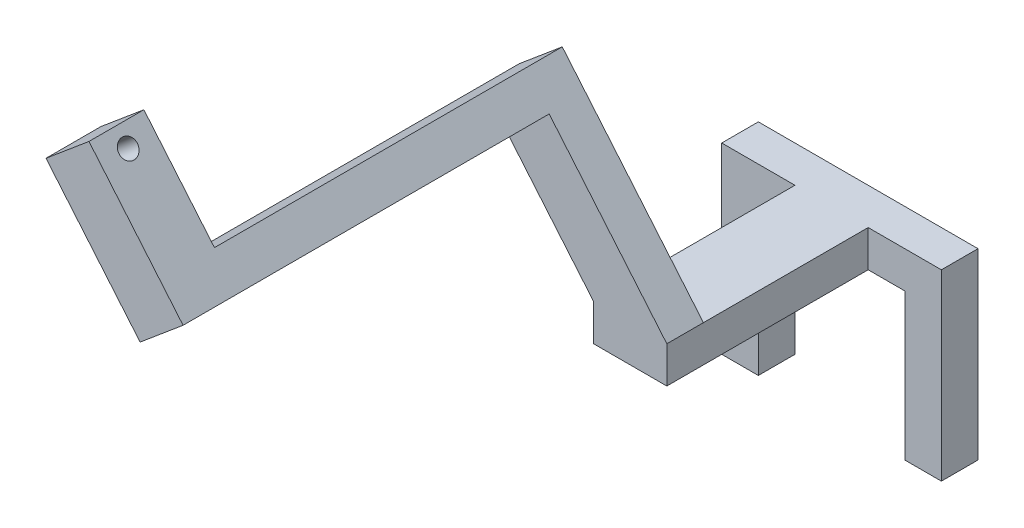
ISO-10303-21;
HEADER;
FILE_DESCRIPTION(('STEP AP214'),'2;1');
FILE_NAME('part.step','',(''),(''),'','','');
FILE_SCHEMA(('AUTOMOTIVE_DESIGN { 1 0 10303 214 1 1 1 1 }'));
ENDSEC;
DATA;
#1=APPLICATION_CONTEXT('core data for automotive mechanical design processes');
#2=APPLICATION_PROTOCOL_DEFINITION('international standard','automotive_design',2000,#1);
#3=PRODUCT_CONTEXT('',#1,'mechanical');
#4=PRODUCT('Part','Part','',(#3));
#5=PRODUCT_RELATED_PRODUCT_CATEGORY('part','',(#4));
#6=PRODUCT_DEFINITION_FORMATION('','',#4);
#7=PRODUCT_DEFINITION_CONTEXT('part definition',#1,'design');
#8=PRODUCT_DEFINITION('design','',#6,#7);
#9=PRODUCT_DEFINITION_SHAPE('','',#8);
#10=(LENGTH_UNIT() NAMED_UNIT(*) SI_UNIT(.MILLI.,.METRE.));
#11=(NAMED_UNIT(*) PLANE_ANGLE_UNIT() SI_UNIT($,.RADIAN.));
#12=(NAMED_UNIT(*) SI_UNIT($,.STERADIAN.) SOLID_ANGLE_UNIT());
#13=UNCERTAINTY_MEASURE_WITH_UNIT(LENGTH_MEASURE(1.E-05),#10,'distance_accuracy_value','');
#14=(GEOMETRIC_REPRESENTATION_CONTEXT(3) GLOBAL_UNCERTAINTY_ASSIGNED_CONTEXT((#13)) GLOBAL_UNIT_ASSIGNED_CONTEXT((#10,
#11,#12)) REPRESENTATION_CONTEXT('',''));
#15=CARTESIAN_POINT('',(0.,0.,0.));
#16=DIRECTION('',(0.,0.,1.));
#17=DIRECTION('',(1.,0.,0.));
#18=AXIS2_PLACEMENT_3D('',#15,#16,#17);
#19=CARTESIAN_POINT('',(0.,0.,10.));
#20=DIRECTION('',(0.,0.,-1.));
#21=DIRECTION('',(-1.,0.,0.));
#22=AXIS2_PLACEMENT_3D('',#19,#20,#21);
#23=PLANE('',#22);
#24=DIRECTION('',(0.,-1.,0.));
#25=VECTOR('',#24,1.);
#26=CARTESIAN_POINT('',(20.,0.,10.));
#27=LINE('',#26,#25);
#28=CARTESIAN_POINT('',(20.,0.,10.));
#29=VERTEX_POINT('',#28);
#30=CARTESIAN_POINT('',(20.,-10.,10.));
#31=VERTEX_POINT('',#30);
#32=EDGE_CURVE('E225',#29,#31,#27,.T.);
#33=ORIENTED_EDGE('',*,*,#32,.F.);
#34=DIRECTION('',(-1.,0.,0.));
#35=VECTOR('',#34,1.);
#36=CARTESIAN_POINT('',(0.,0.,10.));
#37=LINE('',#36,#35);
#38=CARTESIAN_POINT('',(0.,0.,10.));
#39=VERTEX_POINT('',#38);
#40=EDGE_CURVE('E277',#29,#39,#37,.T.);
#41=ORIENTED_EDGE('',*,*,#40,.T.);
#42=DIRECTION('',(0.,-1.,0.));
#43=VECTOR('',#42,1.);
#44=CARTESIAN_POINT('',(0.,-50.,10.));
#45=LINE('',#44,#43);
#46=CARTESIAN_POINT('',(0.,-50.,10.));
#47=VERTEX_POINT('',#46);
#48=EDGE_CURVE('E260',#39,#47,#45,.T.);
#49=ORIENTED_EDGE('',*,*,#48,.T.);
#50=DIRECTION('',(1.,0.,0.));
#51=VECTOR('',#50,1.);
#52=CARTESIAN_POINT('',(10.,-50.,10.));
#53=LINE('',#52,#51);
#54=CARTESIAN_POINT('',(10.,-50.,10.));
#55=VERTEX_POINT('',#54);
#56=EDGE_CURVE('E263',#47,#55,#53,.T.);
#57=ORIENTED_EDGE('',*,*,#56,.T.);
#58=DIRECTION('',(0.,1.,0.));
#59=VECTOR('',#58,1.);
#60=CARTESIAN_POINT('',(10.,-10.,10.));
#61=LINE('',#60,#59);
#62=CARTESIAN_POINT('',(10.,-10.,10.));
#63=VERTEX_POINT('',#62);
#64=EDGE_CURVE('E266',#55,#63,#61,.T.);
#65=ORIENTED_EDGE('',*,*,#64,.T.);
#66=DIRECTION('',(1.,0.,0.));
#67=VECTOR('',#66,1.);
#68=CARTESIAN_POINT('',(50.,-10.,10.));
#69=LINE('',#68,#67);
#70=EDGE_CURVE('E269',#63,#31,#69,.T.);
#71=ORIENTED_EDGE('',*,*,#70,.T.);
#72=EDGE_LOOP('',(#33,#41,#49,#57,#65,#71));
#73=FACE_BOUND('',#72,.T.);
#74=ADVANCED_FACE('F39',(#73),#23,.F.);
#75=DIRECTION('',(0.,1.,0.));
#76=VECTOR('',#75,1.);
#77=CARTESIAN_POINT('',(40.,0.,10.));
#78=LINE('',#77,#76);
#79=CARTESIAN_POINT('',(40.,-10.,10.));
#80=VERTEX_POINT('',#79);
#81=CARTESIAN_POINT('',(40.,0.,10.));
#82=VERTEX_POINT('',#81);
#83=EDGE_CURVE('E237',#80,#82,#78,.T.);
#84=ORIENTED_EDGE('',*,*,#83,.F.);
#85=CARTESIAN_POINT('',(50.,-10.,10.));
#86=VERTEX_POINT('',#85);
#87=EDGE_CURVE('E268',#80,#86,#69,.T.);
#88=ORIENTED_EDGE('',*,*,#87,.T.);
#89=DIRECTION('',(0.,-1.,0.));
#90=VECTOR('',#89,1.);
#91=CARTESIAN_POINT('',(50.,-50.,10.));
#92=LINE('',#91,#90);
#93=CARTESIAN_POINT('',(50.,-50.,10.));
#94=VERTEX_POINT('',#93);
#95=EDGE_CURVE('E271',#86,#94,#92,.T.);
#96=ORIENTED_EDGE('',*,*,#95,.T.);
#97=DIRECTION('',(1.,0.,0.));
#98=VECTOR('',#97,1.);
#99=CARTESIAN_POINT('',(60.,-50.,10.));
#100=LINE('',#99,#98);
#101=CARTESIAN_POINT('',(60.,-50.,10.));
#102=VERTEX_POINT('',#101);
#103=EDGE_CURVE('E273',#94,#102,#100,.T.);
#104=ORIENTED_EDGE('',*,*,#103,.T.);
#105=DIRECTION('',(0.,1.,0.));
#106=VECTOR('',#105,1.);
#107=CARTESIAN_POINT('',(60.,0.,10.));
#108=LINE('',#107,#106);
#109=CARTESIAN_POINT('',(60.,0.,10.));
#110=VERTEX_POINT('',#109);
#111=EDGE_CURVE('E275',#102,#110,#108,.T.);
#112=ORIENTED_EDGE('',*,*,#111,.T.);
#113=EDGE_CURVE('E278',#110,#82,#37,.T.);
#114=ORIENTED_EDGE('',*,*,#113,.T.);
#115=EDGE_LOOP('',(#84,#88,#96,#104,#112,#114));
#116=FACE_BOUND('',#115,.T.);
#117=ADVANCED_FACE('F338',(#116),#23,.F.);
#118=CARTESIAN_POINT('',(0.,-50.,10.));
#119=DIRECTION('',(1.,0.,0.));
#120=DIRECTION('',(0.,0.,-1.));
#121=AXIS2_PLACEMENT_3D('',#118,#119,#120);
#122=PLANE('',#121);
#123=DIRECTION('',(0.,-1.,0.));
#124=VECTOR('',#123,1.);
#125=CARTESIAN_POINT('',(0.,-50.,0.));
#126=LINE('',#125,#124);
#127=CARTESIAN_POINT('',(0.,0.,0.));
#128=VERTEX_POINT('',#127);
#129=CARTESIAN_POINT('',(0.,-50.,0.));
#130=VERTEX_POINT('',#129);
#131=EDGE_CURVE('E259',#128,#130,#126,.T.);
#132=ORIENTED_EDGE('',*,*,#131,.T.);
#133=DIRECTION('',(0.,0.,-1.));
#134=VECTOR('',#133,1.);
#135=CARTESIAN_POINT('',(0.,-50.,10.));
#136=LINE('',#135,#134);
#137=EDGE_CURVE('E11',#47,#130,#136,.T.);
#138=ORIENTED_EDGE('',*,*,#137,.F.);
#139=ORIENTED_EDGE('',*,*,#48,.F.);
#140=DIRECTION('',(0.,0.,-1.));
#141=VECTOR('',#140,1.);
#142=CARTESIAN_POINT('',(0.,0.,10.));
#143=LINE('',#142,#141);
#144=EDGE_CURVE('E281',#39,#128,#143,.T.);
#145=ORIENTED_EDGE('',*,*,#144,.T.);
#146=EDGE_LOOP('',(#132,#138,#139,#145));
#147=FACE_BOUND('',#146,.T.);
#148=ADVANCED_FACE('F41',(#147),#122,.F.);
#149=CARTESIAN_POINT('',(10.,-50.,10.));
#150=DIRECTION('',(0.,1.,0.));
#151=DIRECTION('',(0.,0.,1.));
#152=AXIS2_PLACEMENT_3D('',#149,#150,#151);
#153=PLANE('',#152);
#154=DIRECTION('',(1.,0.,0.));
#155=VECTOR('',#154,1.);
#156=CARTESIAN_POINT('',(10.,-50.,0.));
#157=LINE('',#156,#155);
#158=CARTESIAN_POINT('',(10.,-50.,0.));
#159=VERTEX_POINT('',#158);
#160=EDGE_CURVE('E284',#130,#159,#157,.T.);
#161=ORIENTED_EDGE('',*,*,#160,.T.);
#162=DIRECTION('',(0.,0.,-1.));
#163=VECTOR('',#162,1.);
#164=CARTESIAN_POINT('',(10.,-50.,10.));
#165=LINE('',#164,#163);
#166=EDGE_CURVE('E47',#55,#159,#165,.T.);
#167=ORIENTED_EDGE('',*,*,#166,.F.);
#168=ORIENTED_EDGE('',*,*,#56,.F.);
#169=ORIENTED_EDGE('',*,*,#137,.T.);
#170=EDGE_LOOP('',(#161,#167,#168,#169));
#171=FACE_BOUND('',#170,.T.);
#172=ADVANCED_FACE('F363',(#171),#153,.F.);
#173=CARTESIAN_POINT('',(10.,-10.,10.));
#174=DIRECTION('',(-1.,0.,0.));
#175=DIRECTION('',(0.,-1.,0.));
#176=AXIS2_PLACEMENT_3D('',#173,#174,#175);
#177=PLANE('',#176);
#178=DIRECTION('',(0.,1.,0.));
#179=VECTOR('',#178,1.);
#180=CARTESIAN_POINT('',(10.,-10.,0.));
#181=LINE('',#180,#179);
#182=CARTESIAN_POINT('',(10.,-10.,0.));
#183=VERTEX_POINT('',#182);
#184=EDGE_CURVE('E286',#159,#183,#181,.T.);
#185=ORIENTED_EDGE('',*,*,#184,.T.);
#186=DIRECTION('',(0.,0.,-1.));
#187=VECTOR('',#186,1.);
#188=CARTESIAN_POINT('',(10.,-10.,10.));
#189=LINE('',#188,#187);
#190=EDGE_CURVE('E311',#63,#183,#189,.T.);
#191=ORIENTED_EDGE('',*,*,#190,.F.);
#192=ORIENTED_EDGE('',*,*,#64,.F.);
#193=ORIENTED_EDGE('',*,*,#166,.T.);
#194=EDGE_LOOP('',(#185,#191,#192,#193));
#195=FACE_BOUND('',#194,.T.);
#196=ADVANCED_FACE('F318',(#195),#177,.F.);
#197=CARTESIAN_POINT('',(50.,-10.,10.));
#198=DIRECTION('',(0.,1.,0.));
#199=DIRECTION('',(-1.,0.,0.));
#200=AXIS2_PLACEMENT_3D('',#197,#198,#199);
#201=PLANE('',#200);
#202=DIRECTION('',(1.,0.,0.));
#203=VECTOR('',#202,1.);
#204=CARTESIAN_POINT('',(50.,-10.,0.));
#205=LINE('',#204,#203);
#206=CARTESIAN_POINT('',(50.,-10.,0.));
#207=VERTEX_POINT('',#206);
#208=EDGE_CURVE('E288',#183,#207,#205,.T.);
#209=ORIENTED_EDGE('',*,*,#208,.T.);
#210=DIRECTION('',(0.,0.,-1.));
#211=VECTOR('',#210,1.);
#212=CARTESIAN_POINT('',(50.,-10.,10.));
#213=LINE('',#212,#211);
#214=EDGE_CURVE('E308',#86,#207,#213,.T.);
#215=ORIENTED_EDGE('',*,*,#214,.F.);
#216=ORIENTED_EDGE('',*,*,#87,.F.);
#217=DIRECTION('',(0.,0.,-1.));
#218=VECTOR('',#217,1.);
#219=CARTESIAN_POINT('',(40.,-10.,65.));
#220=LINE('',#219,#218);
#221=CARTESIAN_POINT('',(40.,-10.,65.));
#222=VERTEX_POINT('',#221);
#223=EDGE_CURVE('E253',#222,#80,#220,.T.);
#224=ORIENTED_EDGE('',*,*,#223,.F.);
#225=DIRECTION('',(1.,0.,0.));
#226=VECTOR('',#225,1.);
#227=CARTESIAN_POINT('',(20.,-10.,65.));
#228=LINE('',#227,#226);
#229=CARTESIAN_POINT('',(20.,-10.,65.));
#230=VERTEX_POINT('',#229);
#231=EDGE_CURVE('E236',#230,#222,#228,.T.);
#232=ORIENTED_EDGE('',*,*,#231,.F.);
#233=DIRECTION('',(0.,0.,-1.));
#234=VECTOR('',#233,1.);
#235=CARTESIAN_POINT('',(20.,-10.,65.));
#236=LINE('',#235,#234);
#237=EDGE_CURVE('E256',#230,#31,#236,.T.);
#238=ORIENTED_EDGE('',*,*,#237,.T.);
#239=ORIENTED_EDGE('',*,*,#70,.F.);
#240=ORIENTED_EDGE('',*,*,#190,.T.);
#241=EDGE_LOOP('',(#209,#215,#216,#224,#232,#238,#239,#240));
#242=FACE_BOUND('',#241,.T.);
#243=ADVANCED_FACE('F329',(#242),#201,.F.);
#244=CARTESIAN_POINT('',(50.,-50.,10.));
#245=DIRECTION('',(1.,0.,0.));
#246=DIRECTION('',(0.,0.,-1.));
#247=AXIS2_PLACEMENT_3D('',#244,#245,#246);
#248=PLANE('',#247);
#249=DIRECTION('',(0.,-1.,0.));
#250=VECTOR('',#249,1.);
#251=CARTESIAN_POINT('',(50.,-50.,0.));
#252=LINE('',#251,#250);
#253=CARTESIAN_POINT('',(50.,-50.,0.));
#254=VERTEX_POINT('',#253);
#255=EDGE_CURVE('E290',#207,#254,#252,.T.);
#256=ORIENTED_EDGE('',*,*,#255,.T.);
#257=DIRECTION('',(0.,0.,-1.));
#258=VECTOR('',#257,1.);
#259=CARTESIAN_POINT('',(50.,-50.,10.));
#260=LINE('',#259,#258);
#261=EDGE_CURVE('E305',#94,#254,#260,.T.);
#262=ORIENTED_EDGE('',*,*,#261,.F.);
#263=ORIENTED_EDGE('',*,*,#95,.F.);
#264=ORIENTED_EDGE('',*,*,#214,.T.);
#265=EDGE_LOOP('',(#256,#262,#263,#264));
#266=FACE_BOUND('',#265,.T.);
#267=ADVANCED_FACE('F334',(#266),#248,.F.);
#268=CARTESIAN_POINT('',(60.,-50.,10.));
#269=DIRECTION('',(0.,1.,0.));
#270=DIRECTION('',(0.,0.,1.));
#271=AXIS2_PLACEMENT_3D('',#268,#269,#270);
#272=PLANE('',#271);
#273=DIRECTION('',(1.,0.,0.));
#274=VECTOR('',#273,1.);
#275=CARTESIAN_POINT('',(60.,-50.,0.));
#276=LINE('',#275,#274);
#277=CARTESIAN_POINT('',(60.,-50.,0.));
#278=VERTEX_POINT('',#277);
#279=EDGE_CURVE('E292',#254,#278,#276,.T.);
#280=ORIENTED_EDGE('',*,*,#279,.T.);
#281=DIRECTION('',(0.,0.,-1.));
#282=VECTOR('',#281,1.);
#283=CARTESIAN_POINT('',(60.,-50.,10.));
#284=LINE('',#283,#282);
#285=EDGE_CURVE('E302',#102,#278,#284,.T.);
#286=ORIENTED_EDGE('',*,*,#285,.F.);
#287=ORIENTED_EDGE('',*,*,#103,.F.);
#288=ORIENTED_EDGE('',*,*,#261,.T.);
#289=EDGE_LOOP('',(#280,#286,#287,#288));
#290=FACE_BOUND('',#289,.T.);
#291=ADVANCED_FACE('F414',(#290),#272,.F.);
#292=CARTESIAN_POINT('',(60.,0.,10.));
#293=DIRECTION('',(-1.,0.,0.));
#294=DIRECTION('',(0.,-1.,0.));
#295=AXIS2_PLACEMENT_3D('',#292,#293,#294);
#296=PLANE('',#295);
#297=DIRECTION('',(0.,1.,0.));
#298=VECTOR('',#297,1.);
#299=CARTESIAN_POINT('',(60.,0.,0.));
#300=LINE('',#299,#298);
#301=CARTESIAN_POINT('',(60.,0.,0.));
#302=VERTEX_POINT('',#301);
#303=EDGE_CURVE('E294',#278,#302,#300,.T.);
#304=ORIENTED_EDGE('',*,*,#303,.T.);
#305=DIRECTION('',(0.,0.,-1.));
#306=VECTOR('',#305,1.);
#307=CARTESIAN_POINT('',(60.,0.,10.));
#308=LINE('',#307,#306);
#309=EDGE_CURVE('E299',#110,#302,#308,.T.);
#310=ORIENTED_EDGE('',*,*,#309,.F.);
#311=ORIENTED_EDGE('',*,*,#111,.F.);
#312=ORIENTED_EDGE('',*,*,#285,.T.);
#313=EDGE_LOOP('',(#304,#310,#311,#312));
#314=FACE_BOUND('',#313,.T.);
#315=ADVANCED_FACE('F367',(#314),#296,.F.);
#316=CARTESIAN_POINT('',(0.,0.,10.));
#317=DIRECTION('',(0.,-1.,0.));
#318=DIRECTION('',(0.,0.,-1.));
#319=AXIS2_PLACEMENT_3D('',#316,#317,#318);
#320=PLANE('',#319);
#321=DIRECTION('',(0.,0.,-1.));
#322=VECTOR('',#321,1.);
#323=CARTESIAN_POINT('',(20.,0.,65.));
#324=LINE('',#323,#322);
#325=CARTESIAN_POINT('',(20.,0.,55.));
#326=VERTEX_POINT('',#325);
#327=EDGE_CURVE('E242',#326,#29,#324,.T.);
#328=ORIENTED_EDGE('',*,*,#327,.F.);
#329=DIRECTION('',(1.,0.,0.));
#330=VECTOR('',#329,1.);
#331=CARTESIAN_POINT('',(20.,0.,55.));
#332=LINE('',#331,#330);
#333=CARTESIAN_POINT('',(40.,0.,55.));
#334=VERTEX_POINT('',#333);
#335=EDGE_CURVE('E217',#326,#334,#332,.T.);
#336=ORIENTED_EDGE('',*,*,#335,.T.);
#337=DIRECTION('',(0.,0.,-1.));
#338=VECTOR('',#337,1.);
#339=CARTESIAN_POINT('',(40.,0.,65.));
#340=LINE('',#339,#338);
#341=EDGE_CURVE('E250',#334,#82,#340,.T.);
#342=ORIENTED_EDGE('',*,*,#341,.T.);
#343=ORIENTED_EDGE('',*,*,#113,.F.);
#344=ORIENTED_EDGE('',*,*,#309,.T.);
#345=DIRECTION('',(-1.,0.,0.));
#346=VECTOR('',#345,1.);
#347=CARTESIAN_POINT('',(0.,0.,0.));
#348=LINE('',#347,#346);
#349=EDGE_CURVE('E264',#302,#128,#348,.T.);
#350=ORIENTED_EDGE('',*,*,#349,.T.);
#351=ORIENTED_EDGE('',*,*,#144,.F.);
#352=ORIENTED_EDGE('',*,*,#40,.F.);
#353=EDGE_LOOP('',(#328,#336,#342,#343,#344,#350,#351,#352));
#354=FACE_BOUND('',#353,.T.);
#355=ADVANCED_FACE('F358',(#354),#320,.F.);
#356=CARTESIAN_POINT('',(0.,0.,0.));
#357=DIRECTION('',(0.,0.,-1.));
#358=DIRECTION('',(-1.,0.,0.));
#359=AXIS2_PLACEMENT_3D('',#356,#357,#358);
#360=PLANE('',#359);
#361=ORIENTED_EDGE('',*,*,#131,.F.);
#362=ORIENTED_EDGE('',*,*,#349,.F.);
#363=ORIENTED_EDGE('',*,*,#303,.F.);
#364=ORIENTED_EDGE('',*,*,#279,.F.);
#365=ORIENTED_EDGE('',*,*,#255,.F.);
#366=ORIENTED_EDGE('',*,*,#208,.F.);
#367=ORIENTED_EDGE('',*,*,#184,.F.);
#368=ORIENTED_EDGE('',*,*,#160,.F.);
#369=EDGE_LOOP('',(#361,#362,#363,#364,#365,#366,#367,#368));
#370=FACE_BOUND('',#369,.T.);
#371=ADVANCED_FACE('F324',(#370),#360,.T.);
#372=CARTESIAN_POINT('',(20.,0.,65.));
#373=DIRECTION('',(1.,0.,0.));
#374=DIRECTION('',(0.,1.,0.));
#375=AXIS2_PLACEMENT_3D('',#372,#373,#374);
#376=PLANE('',#375);
#377=ORIENTED_EDGE('',*,*,#32,.T.);
#378=ORIENTED_EDGE('',*,*,#237,.F.);
#379=DIRECTION('',(0.,-1.,0.));
#380=VECTOR('',#379,1.);
#381=CARTESIAN_POINT('',(20.,0.,65.));
#382=LINE('',#381,#380);
#383=CARTESIAN_POINT('',(20.,0.,65.));
#384=VERTEX_POINT('',#383);
#385=EDGE_CURVE('E233',#384,#230,#382,.T.);
#386=ORIENTED_EDGE('',*,*,#385,.F.);
#387=EDGE_CURVE('E247',#384,#326,#324,.T.);
#388=ORIENTED_EDGE('',*,*,#387,.T.);
#389=ORIENTED_EDGE('',*,*,#327,.T.);
#390=EDGE_LOOP('',(#377,#378,#386,#388,#389));
#391=FACE_BOUND('',#390,.T.);
#392=ADVANCED_FACE('F352',(#391),#376,.F.);
#393=CARTESIAN_POINT('',(40.,0.,65.));
#394=DIRECTION('',(-1.,0.,0.));
#395=DIRECTION('',(0.,0.,1.));
#396=AXIS2_PLACEMENT_3D('',#393,#394,#395);
#397=PLANE('',#396);
#398=ORIENTED_EDGE('',*,*,#83,.T.);
#399=ORIENTED_EDGE('',*,*,#341,.F.);
#400=CARTESIAN_POINT('',(40.,0.,65.));
#401=VERTEX_POINT('',#400);
#402=EDGE_CURVE('E251',#401,#334,#340,.T.);
#403=ORIENTED_EDGE('',*,*,#402,.F.);
#404=DIRECTION('',(0.,1.,0.));
#405=VECTOR('',#404,1.);
#406=CARTESIAN_POINT('',(40.,0.,65.));
#407=LINE('',#406,#405);
#408=EDGE_CURVE('E239',#222,#401,#407,.T.);
#409=ORIENTED_EDGE('',*,*,#408,.F.);
#410=ORIENTED_EDGE('',*,*,#223,.T.);
#411=EDGE_LOOP('',(#398,#399,#403,#409,#410));
#412=FACE_BOUND('',#411,.T.);
#413=ADVANCED_FACE('F343',(#412),#397,.F.);
#414=CARTESIAN_POINT('',(0.,0.,65.));
#415=DIRECTION('',(0.,0.,1.));
#416=DIRECTION('',(1.,0.,0.));
#417=AXIS2_PLACEMENT_3D('',#414,#415,#416);
#418=PLANE('',#417);
#419=ORIENTED_EDGE('',*,*,#385,.T.);
#420=ORIENTED_EDGE('',*,*,#231,.T.);
#421=ORIENTED_EDGE('',*,*,#408,.T.);
#422=DIRECTION('',(-0.642787609686544,0.766044443118974,0.));
#423=VECTOR('',#422,1.);
#424=CARTESIAN_POINT('',(40.,0.,65.));
#425=LINE('',#424,#423);
#426=CARTESIAN_POINT('',(7.86061951567281,38.3022221559487,65.));
#427=VERTEX_POINT('',#426);
#428=EDGE_CURVE('E216',#401,#427,#425,.T.);
#429=ORIENTED_EDGE('',*,*,#428,.T.);
#430=DIRECTION('',(-0.766044443118974,-0.642787609686544,0.));
#431=VECTOR('',#430,1.);
#432=CARTESIAN_POINT('',(7.86061951567281,38.3022221559487,65.));
#433=LINE('',#432,#431);
#434=CARTESIAN_POINT('',(-3.87586226099637,28.4541446258266,65.));
#435=VERTEX_POINT('',#434);
#436=EDGE_CURVE('E228',#427,#435,#433,.T.);
#437=ORIENTED_EDGE('',*,*,#436,.T.);
#438=DIRECTION('',(0.642787609686544,-0.766044443118975,0.));
#439=VECTOR('',#438,1.);
#440=CARTESIAN_POINT('',(-3.87586226099637,28.4541446258266,65.));
#441=LINE('',#440,#439);
#442=EDGE_CURVE('E220',#435,#384,#441,.T.);
#443=ORIENTED_EDGE('',*,*,#442,.T.);
#444=EDGE_LOOP('',(#419,#420,#421,#429,#437,#443));
#445=FACE_BOUND('',#444,.T.);
#446=ADVANCED_FACE('F347',(#445),#418,.T.);
#447=CARTESIAN_POINT('',(-3.87586226099637,28.4541446258266,55.));
#448=DIRECTION('',(-0.766044443118975,-0.642787609686544,0.));
#449=DIRECTION('',(0.642787609686544,-0.766044443118975,0.));
#450=AXIS2_PLACEMENT_3D('',#447,#448,#449);
#451=PLANE('',#450);
#452=CARTESIAN_POINT('',(-26.3734286000254,55.2657001349907,157.5));
#453=DIRECTION('',(-0.766044443118975,-0.642787609686544,0.));
#454=DIRECTION('',(0.642787609686544,-0.766044443118975,0.));
#455=AXIS2_PLACEMENT_3D('',#452,#453,#454);
#456=CIRCLE('',#455,2.5);
#457=CARTESIAN_POINT('',(-24.7664595758091,53.3505890271933,157.5));
#458=VERTEX_POINT('',#457);
#459=EDGE_CURVE('E376',#458,#458,#456,.T.);
#460=ORIENTED_EDGE('',*,*,#459,.F.);
#461=EDGE_LOOP('',(#460));
#462=FACE_BOUND('',#461,.T.);
#463=ORIENTED_EDGE('',*,*,#442,.F.);
#464=DIRECTION('',(0.,0.,1.));
#465=VECTOR('',#464,1.);
#466=CARTESIAN_POINT('',(-3.87586226099638,28.4541446258266,55.));
#467=LINE('',#466,#465);
#468=CARTESIAN_POINT('',(-3.87586226099637,28.4541446258266,165.));
#469=VERTEX_POINT('',#468);
#470=EDGE_CURVE('E194',#435,#469,#467,.T.);
#471=ORIENTED_EDGE('',*,*,#470,.T.);
#472=DIRECTION('',(0.642787609686544,-0.766044443118974,0.));
#473=VECTOR('',#472,1.);
#474=CARTESIAN_POINT('',(-10.3037383578618,36.1145890570164,165.));
#475=LINE('',#474,#473);
#476=CARTESIAN_POINT('',(-29.5873666484581,59.0959223505856,165.));
#477=VERTEX_POINT('',#476);
#478=EDGE_CURVE('E213',#477,#469,#475,.T.);
#479=ORIENTED_EDGE('',*,*,#478,.F.);
#480=DIRECTION('',(0.,0.,1.));
#481=VECTOR('',#480,1.);
#482=CARTESIAN_POINT('',(-29.5873666484581,59.0959223505856,165.));
#483=LINE('',#482,#481);
#484=CARTESIAN_POINT('',(-29.5873666484581,59.0959223505856,150.));
#485=VERTEX_POINT('',#484);
#486=EDGE_CURVE('E181',#485,#477,#483,.T.);
#487=ORIENTED_EDGE('',*,*,#486,.F.);
#488=DIRECTION('',(0.642787609686544,-0.766044443118974,0.));
#489=VECTOR('',#488,1.);
#490=CARTESIAN_POINT('',(-29.5873666484581,59.0959223505856,150.));
#491=LINE('',#490,#489);
#492=CARTESIAN_POINT('',(-10.3037383578618,36.1145890570164,150.));
#493=VERTEX_POINT('',#492);
#494=EDGE_CURVE('E177',#485,#493,#491,.T.);
#495=ORIENTED_EDGE('',*,*,#494,.T.);
#496=DIRECTION('',(0.,0.,1.));
#497=VECTOR('',#496,1.);
#498=CARTESIAN_POINT('',(-10.3037383578618,36.1145890570164,55.));
#499=LINE('',#498,#497);
#500=CARTESIAN_POINT('',(-10.3037383578618,36.1145890570164,55.));
#501=VERTEX_POINT('',#500);
#502=EDGE_CURVE('E201',#501,#493,#499,.T.);
#503=ORIENTED_EDGE('',*,*,#502,.F.);
#504=DIRECTION('',(0.642787609686544,-0.766044443118975,0.));
#505=VECTOR('',#504,1.);
#506=CARTESIAN_POINT('',(-3.87586226099637,28.4541446258266,55.));
#507=LINE('',#506,#505);
#508=EDGE_CURVE('E222',#501,#326,#507,.T.);
#509=ORIENTED_EDGE('',*,*,#508,.T.);
#510=ORIENTED_EDGE('',*,*,#387,.F.);
#511=EDGE_LOOP('',(#463,#471,#479,#487,#495,#503,#509,#510));
#512=FACE_BOUND('',#511,.T.);
#513=ADVANCED_FACE('F374',(#462,#512),#451,.T.);
#514=CARTESIAN_POINT('',(40.,0.,55.));
#515=DIRECTION('',(0.766044443118974,0.642787609686544,0.));
#516=DIRECTION('',(-0.642787609686544,0.766044443118974,0.));
#517=AXIS2_PLACEMENT_3D('',#514,#515,#516);
#518=PLANE('',#517);
#519=CARTESIAN_POINT('',(-14.6369468233562,65.1137776651128,157.5));
#520=DIRECTION('',(0.766044443118975,0.642787609686543,0.));
#521=DIRECTION('',(-0.642787609686543,0.766044443118975,0.));
#522=AXIS2_PLACEMENT_3D('',#519,#520,#521);
#523=CIRCLE('',#522,2.5);
#524=CARTESIAN_POINT('',(-16.2439158475726,67.0288887729103,157.5));
#525=VERTEX_POINT('',#524);
#526=EDGE_CURVE('E378',#525,#525,#523,.T.);
#527=ORIENTED_EDGE('',*,*,#526,.F.);
#528=EDGE_LOOP('',(#527));
#529=FACE_BOUND('',#528,.T.);
#530=ORIENTED_EDGE('',*,*,#428,.F.);
#531=ORIENTED_EDGE('',*,*,#402,.T.);
#532=DIRECTION('',(-0.642787609686544,0.766044443118974,0.));
#533=VECTOR('',#532,1.);
#534=CARTESIAN_POINT('',(40.,0.,55.));
#535=LINE('',#534,#533);
#536=CARTESIAN_POINT('',(1.43274341880737,45.9626665871385,55.));
#537=VERTEX_POINT('',#536);
#538=EDGE_CURVE('E62',#334,#537,#535,.T.);
#539=ORIENTED_EDGE('',*,*,#538,.T.);
#540=DIRECTION('',(0.,0.,-1.));
#541=VECTOR('',#540,1.);
#542=CARTESIAN_POINT('',(1.43274341880737,45.9626665871385,55.));
#543=LINE('',#542,#541);
#544=CARTESIAN_POINT('',(1.43274341880738,45.9626665871385,150.));
#545=VERTEX_POINT('',#544);
#546=EDGE_CURVE('E193',#545,#537,#543,.T.);
#547=ORIENTED_EDGE('',*,*,#546,.F.);
#548=DIRECTION('',(0.642787609686544,-0.766044443118974,0.));
#549=VECTOR('',#548,1.);
#550=CARTESIAN_POINT('',(-17.8508848717889,68.9439998807077,150.));
#551=LINE('',#550,#549);
#552=CARTESIAN_POINT('',(-17.8508848717889,68.9439998807077,150.));
#553=VERTEX_POINT('',#552);
#554=EDGE_CURVE('E175',#553,#545,#551,.T.);
#555=ORIENTED_EDGE('',*,*,#554,.F.);
#556=DIRECTION('',(0.,0.,-1.));
#557=VECTOR('',#556,1.);
#558=CARTESIAN_POINT('',(-17.8508848717889,68.9439998807077,165.));
#559=LINE('',#558,#557);
#560=CARTESIAN_POINT('',(-17.8508848717889,68.9439998807077,165.));
#561=VERTEX_POINT('',#560);
#562=EDGE_CURVE('E182',#561,#553,#559,.T.);
#563=ORIENTED_EDGE('',*,*,#562,.F.);
#564=DIRECTION('',(0.642787609686544,-0.766044443118974,0.));
#565=VECTOR('',#564,1.);
#566=CARTESIAN_POINT('',(1.43274341880738,45.9626665871385,165.));
#567=LINE('',#566,#565);
#568=CARTESIAN_POINT('',(7.86061951567282,38.3022221559487,165.));
#569=VERTEX_POINT('',#568);
#570=EDGE_CURVE('E207',#561,#569,#567,.T.);
#571=ORIENTED_EDGE('',*,*,#570,.T.);
#572=DIRECTION('',(0.,0.,-1.));
#573=VECTOR('',#572,1.);
#574=CARTESIAN_POINT('',(7.86061951567281,38.3022221559487,55.));
#575=LINE('',#574,#573);
#576=EDGE_CURVE('E203',#569,#427,#575,.T.);
#577=ORIENTED_EDGE('',*,*,#576,.T.);
#578=EDGE_LOOP('',(#530,#531,#539,#547,#555,#563,#571,#577));
#579=FACE_BOUND('',#578,.T.);
#580=ADVANCED_FACE('F192',(#529,#579),#518,.T.);
#581=CARTESIAN_POINT('',(0.,0.,55.));
#582=DIRECTION('',(0.,0.,1.));
#583=DIRECTION('',(1.,0.,0.));
#584=AXIS2_PLACEMENT_3D('',#581,#582,#583);
#585=PLANE('',#584);
#586=ORIENTED_EDGE('',*,*,#335,.F.);
#587=ORIENTED_EDGE('',*,*,#508,.F.);
#588=DIRECTION('',(-0.766044443118974,-0.642787609686544,0.));
#589=VECTOR('',#588,1.);
#590=CARTESIAN_POINT('',(-10.3037383578618,36.1145890570164,55.));
#591=LINE('',#590,#589);
#592=EDGE_CURVE('E205',#537,#501,#591,.T.);
#593=ORIENTED_EDGE('',*,*,#592,.F.);
#594=ORIENTED_EDGE('',*,*,#538,.F.);
#595=EDGE_LOOP('',(#586,#587,#593,#594));
#596=FACE_BOUND('',#595,.T.);
#597=ADVANCED_FACE('F370',(#596),#585,.F.);
#598=CARTESIAN_POINT('',(-10.3037383578618,36.1145890570164,165.));
#599=DIRECTION('',(0.,0.,-1.));
#600=DIRECTION('',(-1.,0.,0.));
#601=AXIS2_PLACEMENT_3D('',#598,#599,#600);
#602=PLANE('',#601);
#603=DIRECTION('',(0.766044443118974,0.642787609686544,0.));
#604=VECTOR('',#603,1.);
#605=CARTESIAN_POINT('',(-3.87586226099637,28.4541446258266,165.));
#606=LINE('',#605,#604);
#607=EDGE_CURVE('E196',#469,#569,#606,.T.);
#608=ORIENTED_EDGE('',*,*,#607,.T.);
#609=ORIENTED_EDGE('',*,*,#570,.F.);
#610=DIRECTION('',(0.766044443118974,0.642787609686544,0.));
#611=VECTOR('',#610,1.);
#612=CARTESIAN_POINT('',(-17.8508848717889,68.9439998807077,165.));
#613=LINE('',#612,#611);
#614=EDGE_CURVE('E188',#477,#561,#613,.T.);
#615=ORIENTED_EDGE('',*,*,#614,.F.);
#616=ORIENTED_EDGE('',*,*,#478,.T.);
#617=EDGE_LOOP('',(#608,#609,#615,#616));
#618=FACE_BOUND('',#617,.T.);
#619=ADVANCED_FACE('F395',(#618),#602,.F.);
#620=CARTESIAN_POINT('',(-22.040220134531,26.2665115268943,0.));
#621=DIRECTION('',(-0.642787609686544,0.766044443118974,0.));
#622=DIRECTION('',(-0.766044443118974,-0.642787609686544,0.));
#623=AXIS2_PLACEMENT_3D('',#620,#621,#622);
#624=PLANE('',#623);
#625=DIRECTION('',(-0.766044443118974,-0.642787609686544,0.));
#626=VECTOR('',#625,1.);
#627=CARTESIAN_POINT('',(1.43274341880737,45.9626665871385,150.));
#628=LINE('',#627,#626);
#629=EDGE_CURVE('E54',#545,#493,#628,.T.);
#630=ORIENTED_EDGE('',*,*,#629,.F.);
#631=ORIENTED_EDGE('',*,*,#546,.T.);
#632=ORIENTED_EDGE('',*,*,#592,.T.);
#633=ORIENTED_EDGE('',*,*,#502,.T.);
#634=EDGE_LOOP('',(#630,#631,#632,#633));
#635=FACE_BOUND('',#634,.T.);
#636=ADVANCED_FACE('F375',(#635),#624,.T.);
#637=CARTESIAN_POINT('',(-15.6123440376656,18.6060670957045,0.));
#638=DIRECTION('',(-0.642787609686544,0.766044443118974,0.));
#639=DIRECTION('',(-0.766044443118974,-0.642787609686544,0.));
#640=AXIS2_PLACEMENT_3D('',#637,#638,#639);
#641=PLANE('',#640);
#642=ORIENTED_EDGE('',*,*,#436,.F.);
#643=ORIENTED_EDGE('',*,*,#576,.F.);
#644=ORIENTED_EDGE('',*,*,#607,.F.);
#645=ORIENTED_EDGE('',*,*,#470,.F.);
#646=EDGE_LOOP('',(#642,#643,#644,#645));
#647=FACE_BOUND('',#646,.T.);
#648=ADVANCED_FACE('F543',(#647),#641,.F.);
#649=CARTESIAN_POINT('',(-17.8508848717889,68.9439998807077,150.));
#650=DIRECTION('',(0.,0.,1.));
#651=DIRECTION('',(0.,-1.,0.));
#652=AXIS2_PLACEMENT_3D('',#649,#650,#651);
#653=PLANE('',#652);
#654=ORIENTED_EDGE('',*,*,#629,.T.);
#655=ORIENTED_EDGE('',*,*,#494,.F.);
#656=DIRECTION('',(-0.766044443118974,-0.642787609686544,0.));
#657=VECTOR('',#656,1.);
#658=CARTESIAN_POINT('',(-17.8508848717889,68.9439998807077,150.));
#659=LINE('',#658,#657);
#660=EDGE_CURVE('E171',#553,#485,#659,.T.);
#661=ORIENTED_EDGE('',*,*,#660,.F.);
#662=ORIENTED_EDGE('',*,*,#554,.T.);
#663=EDGE_LOOP('',(#654,#655,#661,#662));
#664=FACE_BOUND('',#663,.T.);
#665=ADVANCED_FACE('F173',(#664),#653,.F.);
#666=CARTESIAN_POINT('',(-41.3238484251273,49.2478448204635,0.));
#667=DIRECTION('',(-0.642787609686544,0.766044443118974,0.));
#668=DIRECTION('',(-0.766044443118974,-0.642787609686544,0.));
#669=AXIS2_PLACEMENT_3D('',#666,#667,#668);
#670=PLANE('',#669);
#671=ORIENTED_EDGE('',*,*,#562,.T.);
#672=ORIENTED_EDGE('',*,*,#660,.T.);
#673=ORIENTED_EDGE('',*,*,#486,.T.);
#674=ORIENTED_EDGE('',*,*,#614,.T.);
#675=EDGE_LOOP('',(#671,#672,#673,#674));
#676=FACE_BOUND('',#675,.T.);
#677=ADVANCED_FACE('F186',(#676),#670,.T.);
#678=CARTESIAN_POINT('',(-80.0926836764628,10.1898930132334,157.5));
#679=DIRECTION('',(0.766044443118975,0.642787609686544,0.));
#680=DIRECTION('',(-0.642787609686543,0.766044443118974,0.));
#681=AXIS2_PLACEMENT_3D('',#678,#679,#680);
#682=CYLINDRICAL_SURFACE('',#681,2.5);
#683=ORIENTED_EDGE('',*,*,#459,.T.);
#684=EDGE_LOOP('',(#683));
#685=FACE_BOUND('',#684,.T.);
#686=ORIENTED_EDGE('',*,*,#526,.T.);
#687=EDGE_LOOP('',(#686));
#688=FACE_BOUND('',#687,.T.);
#689=ADVANCED_FACE('F386',(#685,#688),#682,.F.);
#690=CLOSED_SHELL('',(#74,#117,#148,#172,#196,#243,#267,#291,#315,#355,#371,#392,#413,#446,#513,
#580,#597,#619,#636,#648,#665,#677,#689));
#691=MANIFOLD_SOLID_BREP('B2',#690);
#692=ADVANCED_BREP_SHAPE_REPRESENTATION('',(#18,#691),#14);
#693=SHAPE_DEFINITION_REPRESENTATION(#9,#692);
ENDSEC;
END-ISO-10303-21;
